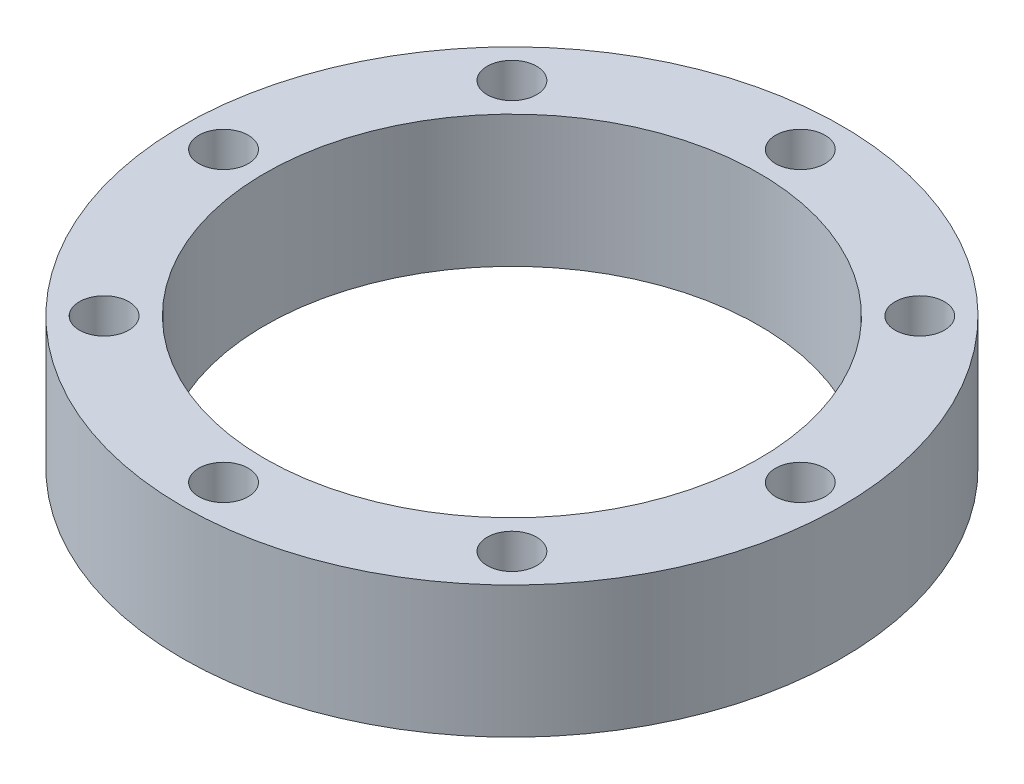
ISO-10303-21;
HEADER;
FILE_DESCRIPTION(('STEP AP214'),'2;1');
FILE_NAME('part.step','',(''),(''),'','','');
FILE_SCHEMA(('AUTOMOTIVE_DESIGN { 1 0 10303 214 1 1 1 1 }'));
ENDSEC;
DATA;
#1=APPLICATION_CONTEXT('core data for automotive mechanical design processes');
#2=APPLICATION_PROTOCOL_DEFINITION('international standard','automotive_design',2000,#1);
#3=PRODUCT_CONTEXT('',#1,'mechanical');
#4=PRODUCT('Part','Part','',(#3));
#5=PRODUCT_RELATED_PRODUCT_CATEGORY('part','',(#4));
#6=PRODUCT_DEFINITION_FORMATION('','',#4);
#7=PRODUCT_DEFINITION_CONTEXT('part definition',#1,'design');
#8=PRODUCT_DEFINITION('design','',#6,#7);
#9=PRODUCT_DEFINITION_SHAPE('','',#8);
#10=(LENGTH_UNIT() NAMED_UNIT(*) SI_UNIT(.MILLI.,.METRE.));
#11=(NAMED_UNIT(*) PLANE_ANGLE_UNIT() SI_UNIT($,.RADIAN.));
#12=(NAMED_UNIT(*) SI_UNIT($,.STERADIAN.) SOLID_ANGLE_UNIT());
#13=UNCERTAINTY_MEASURE_WITH_UNIT(LENGTH_MEASURE(1.E-05),#10,'distance_accuracy_value','');
#14=(GEOMETRIC_REPRESENTATION_CONTEXT(3) GLOBAL_UNCERTAINTY_ASSIGNED_CONTEXT((#13)) GLOBAL_UNIT_ASSIGNED_CONTEXT((#10,
#11,#12)) REPRESENTATION_CONTEXT('',''));
#15=CARTESIAN_POINT('',(0.,0.,0.));
#16=DIRECTION('',(0.,0.,1.));
#17=DIRECTION('',(1.,0.,0.));
#18=AXIS2_PLACEMENT_3D('',#15,#16,#17);
#19=CARTESIAN_POINT('',(0.,8.,0.));
#20=DIRECTION('',(0.,1.,0.));
#21=DIRECTION('',(0.,0.,1.));
#22=AXIS2_PLACEMENT_3D('',#19,#20,#21);
#23=PLANE('',#22);
#24=CARTESIAN_POINT('',(-17.5,8.,-1.83302770289265E-13));
#25=DIRECTION('',(0.,1.,0.));
#26=DIRECTION('',(0.,0.,1.));
#27=AXIS2_PLACEMENT_3D('',#24,#25,#26);
#28=CIRCLE('',#27,1.5);
#29=CARTESIAN_POINT('',(-17.5,8.,1.49999999999982));
#30=VERTEX_POINT('',#29);
#31=EDGE_CURVE('E110',#30,#30,#28,.T.);
#32=ORIENTED_EDGE('',*,*,#31,.F.);
#33=EDGE_LOOP('',(#32));
#34=FACE_BOUND('',#33,.T.);
#35=CARTESIAN_POINT('',(-1.2220184685951E-13,8.,17.5));
#36=DIRECTION('',(0.,1.,0.));
#37=DIRECTION('',(0.,0.,1.));
#38=AXIS2_PLACEMENT_3D('',#35,#36,#37);
#39=CIRCLE('',#38,1.5);
#40=CARTESIAN_POINT('',(-1.2220184685951E-13,8.,19.));
#41=VERTEX_POINT('',#40);
#42=EDGE_CURVE('E94',#41,#41,#39,.T.);
#43=ORIENTED_EDGE('',*,*,#42,.F.);
#44=EDGE_LOOP('',(#43));
#45=FACE_BOUND('',#44,.T.);
#46=CARTESIAN_POINT('',(17.5,8.,0.));
#47=DIRECTION('',(0.,1.,0.));
#48=DIRECTION('',(0.,0.,1.));
#49=AXIS2_PLACEMENT_3D('',#46,#47,#48);
#50=CIRCLE('',#49,1.5);
#51=CARTESIAN_POINT('',(17.5,8.,1.50000000000006));
#52=VERTEX_POINT('',#51);
#53=EDGE_CURVE('E78',#52,#52,#50,.T.);
#54=ORIENTED_EDGE('',*,*,#53,.F.);
#55=EDGE_LOOP('',(#54));
#56=FACE_BOUND('',#55,.T.);
#57=CARTESIAN_POINT('',(0.,8.,-17.5));
#58=DIRECTION('',(0.,1.,0.));
#59=DIRECTION('',(0.,0.,1.));
#60=AXIS2_PLACEMENT_3D('',#57,#58,#59);
#61=CIRCLE('',#60,1.5);
#62=CARTESIAN_POINT('',(0.,8.,-16.));
#63=VERTEX_POINT('',#62);
#64=EDGE_CURVE('E62',#63,#63,#61,.T.);
#65=ORIENTED_EDGE('',*,*,#64,.F.);
#66=EDGE_LOOP('',(#65));
#67=FACE_BOUND('',#66,.T.);
#68=CARTESIAN_POINT('',(0.,8.,0.));
#69=DIRECTION('',(0.,1.,0.));
#70=DIRECTION('',(0.,0.,1.));
#71=AXIS2_PLACEMENT_3D('',#68,#69,#70);
#72=CIRCLE('',#71,20.);
#73=CARTESIAN_POINT('',(0.,8.,20.));
#74=VERTEX_POINT('',#73);
#75=EDGE_CURVE('E10',#74,#74,#72,.T.);
#76=ORIENTED_EDGE('',*,*,#75,.T.);
#77=EDGE_LOOP('',(#76));
#78=FACE_BOUND('',#77,.T.);
#79=CARTESIAN_POINT('',(0.,8.,0.));
#80=DIRECTION('',(0.,1.,0.));
#81=DIRECTION('',(0.,0.,1.));
#82=AXIS2_PLACEMENT_3D('',#79,#80,#81);
#83=CIRCLE('',#82,15.);
#84=CARTESIAN_POINT('',(0.,8.,15.));
#85=VERTEX_POINT('',#84);
#86=EDGE_CURVE('E56',#85,#85,#83,.T.);
#87=ORIENTED_EDGE('',*,*,#86,.F.);
#88=EDGE_LOOP('',(#87));
#89=FACE_BOUND('',#88,.T.);
#90=CARTESIAN_POINT('',(12.3743686707646,8.,-12.3743686707646));
#91=DIRECTION('',(0.,1.,0.));
#92=DIRECTION('',(0.,0.,1.));
#93=AXIS2_PLACEMENT_3D('',#90,#91,#92);
#94=CIRCLE('',#93,1.5);
#95=CARTESIAN_POINT('',(12.3743686707646,8.,-10.8743686707646));
#96=VERTEX_POINT('',#95);
#97=EDGE_CURVE('E70',#96,#96,#94,.T.);
#98=ORIENTED_EDGE('',*,*,#97,.F.);
#99=EDGE_LOOP('',(#98));
#100=FACE_BOUND('',#99,.T.);
#101=CARTESIAN_POINT('',(12.3743686707645,8.,12.3743686707646));
#102=DIRECTION('',(0.,1.,0.));
#103=DIRECTION('',(0.,0.,1.));
#104=AXIS2_PLACEMENT_3D('',#101,#102,#103);
#105=CIRCLE('',#104,1.5);
#106=CARTESIAN_POINT('',(12.3743686707645,8.,13.8743686707646));
#107=VERTEX_POINT('',#106);
#108=EDGE_CURVE('E86',#107,#107,#105,.T.);
#109=ORIENTED_EDGE('',*,*,#108,.F.);
#110=EDGE_LOOP('',(#109));
#111=FACE_BOUND('',#110,.T.);
#112=CARTESIAN_POINT('',(-12.3743686707647,8.,12.3743686707645));
#113=DIRECTION('',(0.,1.,0.));
#114=DIRECTION('',(0.,0.,1.));
#115=AXIS2_PLACEMENT_3D('',#112,#113,#114);
#116=CIRCLE('',#115,1.5);
#117=CARTESIAN_POINT('',(-12.3743686707647,8.,13.8743686707645));
#118=VERTEX_POINT('',#117);
#119=EDGE_CURVE('E102',#118,#118,#116,.T.);
#120=ORIENTED_EDGE('',*,*,#119,.F.);
#121=EDGE_LOOP('',(#120));
#122=FACE_BOUND('',#121,.T.);
#123=CARTESIAN_POINT('',(-12.3743686707644,8.,-12.3743686707647));
#124=DIRECTION('',(0.,1.,0.));
#125=DIRECTION('',(0.,0.,1.));
#126=AXIS2_PLACEMENT_3D('',#123,#124,#125);
#127=CIRCLE('',#126,1.5);
#128=CARTESIAN_POINT('',(-12.3743686707644,8.,-10.8743686707647));
#129=VERTEX_POINT('',#128);
#130=EDGE_CURVE('E118',#129,#129,#127,.T.);
#131=ORIENTED_EDGE('',*,*,#130,.F.);
#132=EDGE_LOOP('',(#131));
#133=FACE_BOUND('',#132,.T.);
#134=ADVANCED_FACE('F43',(#34,#45,#56,#67,#78,#89,#100,#111,#122,#133),#23,.T.);
#135=CARTESIAN_POINT('',(0.,0.,0.));
#136=DIRECTION('',(0.,1.,0.));
#137=DIRECTION('',(0.,0.,1.));
#138=AXIS2_PLACEMENT_3D('',#135,#136,#137);
#139=PLANE('',#138);
#140=CARTESIAN_POINT('',(0.,0.,0.));
#141=DIRECTION('',(0.,1.,0.));
#142=DIRECTION('',(0.,0.,1.));
#143=AXIS2_PLACEMENT_3D('',#140,#141,#142);
#144=CIRCLE('',#143,20.);
#145=CARTESIAN_POINT('',(0.,0.,20.));
#146=VERTEX_POINT('',#145);
#147=EDGE_CURVE('E47',#146,#146,#144,.T.);
#148=ORIENTED_EDGE('',*,*,#147,.F.);
#149=EDGE_LOOP('',(#148));
#150=FACE_BOUND('',#149,.T.);
#151=CARTESIAN_POINT('',(0.,0.,0.));
#152=DIRECTION('',(0.,1.,0.));
#153=DIRECTION('',(0.,0.,1.));
#154=AXIS2_PLACEMENT_3D('',#151,#152,#153);
#155=CIRCLE('',#154,15.);
#156=CARTESIAN_POINT('',(0.,0.,15.));
#157=VERTEX_POINT('',#156);
#158=EDGE_CURVE('E58',#157,#157,#155,.T.);
#159=ORIENTED_EDGE('',*,*,#158,.T.);
#160=EDGE_LOOP('',(#159));
#161=FACE_BOUND('',#160,.T.);
#162=CARTESIAN_POINT('',(0.,0.,-17.5));
#163=DIRECTION('',(0.,1.,0.));
#164=DIRECTION('',(0.,0.,1.));
#165=AXIS2_PLACEMENT_3D('',#162,#163,#164);
#166=CIRCLE('',#165,1.5);
#167=CARTESIAN_POINT('',(0.,0.,-16.));
#168=VERTEX_POINT('',#167);
#169=EDGE_CURVE('E66',#168,#168,#166,.T.);
#170=ORIENTED_EDGE('',*,*,#169,.T.);
#171=EDGE_LOOP('',(#170));
#172=FACE_BOUND('',#171,.T.);
#173=CARTESIAN_POINT('',(12.3743686707646,0.,-12.3743686707646));
#174=DIRECTION('',(0.,1.,0.));
#175=DIRECTION('',(0.,0.,1.));
#176=AXIS2_PLACEMENT_3D('',#173,#174,#175);
#177=CIRCLE('',#176,1.5);
#178=CARTESIAN_POINT('',(12.3743686707646,0.,-10.8743686707646));
#179=VERTEX_POINT('',#178);
#180=EDGE_CURVE('E74',#179,#179,#177,.T.);
#181=ORIENTED_EDGE('',*,*,#180,.T.);
#182=EDGE_LOOP('',(#181));
#183=FACE_BOUND('',#182,.T.);
#184=CARTESIAN_POINT('',(17.5,0.,0.));
#185=DIRECTION('',(0.,1.,0.));
#186=DIRECTION('',(0.,0.,1.));
#187=AXIS2_PLACEMENT_3D('',#184,#185,#186);
#188=CIRCLE('',#187,1.5);
#189=CARTESIAN_POINT('',(17.5,0.,1.50000000000006));
#190=VERTEX_POINT('',#189);
#191=EDGE_CURVE('E82',#190,#190,#188,.T.);
#192=ORIENTED_EDGE('',*,*,#191,.T.);
#193=EDGE_LOOP('',(#192));
#194=FACE_BOUND('',#193,.T.);
#195=CARTESIAN_POINT('',(12.3743686707645,0.,12.3743686707646));
#196=DIRECTION('',(0.,1.,0.));
#197=DIRECTION('',(0.,0.,1.));
#198=AXIS2_PLACEMENT_3D('',#195,#196,#197);
#199=CIRCLE('',#198,1.5);
#200=CARTESIAN_POINT('',(12.3743686707645,0.,13.8743686707646));
#201=VERTEX_POINT('',#200);
#202=EDGE_CURVE('E90',#201,#201,#199,.T.);
#203=ORIENTED_EDGE('',*,*,#202,.T.);
#204=EDGE_LOOP('',(#203));
#205=FACE_BOUND('',#204,.T.);
#206=CARTESIAN_POINT('',(-1.2220184685951E-13,0.,17.5));
#207=DIRECTION('',(0.,1.,0.));
#208=DIRECTION('',(0.,0.,1.));
#209=AXIS2_PLACEMENT_3D('',#206,#207,#208);
#210=CIRCLE('',#209,1.5);
#211=CARTESIAN_POINT('',(-1.2220184685951E-13,0.,19.));
#212=VERTEX_POINT('',#211);
#213=EDGE_CURVE('E98',#212,#212,#210,.T.);
#214=ORIENTED_EDGE('',*,*,#213,.T.);
#215=EDGE_LOOP('',(#214));
#216=FACE_BOUND('',#215,.T.);
#217=CARTESIAN_POINT('',(-12.3743686707647,0.,12.3743686707645));
#218=DIRECTION('',(0.,1.,0.));
#219=DIRECTION('',(0.,0.,1.));
#220=AXIS2_PLACEMENT_3D('',#217,#218,#219);
#221=CIRCLE('',#220,1.5);
#222=CARTESIAN_POINT('',(-12.3743686707647,0.,13.8743686707645));
#223=VERTEX_POINT('',#222);
#224=EDGE_CURVE('E106',#223,#223,#221,.T.);
#225=ORIENTED_EDGE('',*,*,#224,.T.);
#226=EDGE_LOOP('',(#225));
#227=FACE_BOUND('',#226,.T.);
#228=CARTESIAN_POINT('',(-17.5,0.,-1.83302770289265E-13));
#229=DIRECTION('',(0.,1.,0.));
#230=DIRECTION('',(0.,0.,1.));
#231=AXIS2_PLACEMENT_3D('',#228,#229,#230);
#232=CIRCLE('',#231,1.5);
#233=CARTESIAN_POINT('',(-17.5,0.,1.49999999999982));
#234=VERTEX_POINT('',#233);
#235=EDGE_CURVE('E114',#234,#234,#232,.T.);
#236=ORIENTED_EDGE('',*,*,#235,.T.);
#237=EDGE_LOOP('',(#236));
#238=FACE_BOUND('',#237,.T.);
#239=CARTESIAN_POINT('',(-12.3743686707644,0.,-12.3743686707647));
#240=DIRECTION('',(0.,1.,0.));
#241=DIRECTION('',(0.,0.,1.));
#242=AXIS2_PLACEMENT_3D('',#239,#240,#241);
#243=CIRCLE('',#242,1.5);
#244=CARTESIAN_POINT('',(-12.3743686707644,0.,-10.8743686707647));
#245=VERTEX_POINT('',#244);
#246=EDGE_CURVE('E122',#245,#245,#243,.T.);
#247=ORIENTED_EDGE('',*,*,#246,.T.);
#248=EDGE_LOOP('',(#247));
#249=FACE_BOUND('',#248,.T.);
#250=ADVANCED_FACE('F134',(#150,#161,#172,#183,#194,#205,#216,#227,#238,#249),#139,.F.);
#251=CARTESIAN_POINT('',(0.,8.,0.));
#252=DIRECTION('',(0.,-1.,0.));
#253=DIRECTION('',(0.,0.,-1.));
#254=AXIS2_PLACEMENT_3D('',#251,#252,#253);
#255=CYLINDRICAL_SURFACE('',#254,20.);
#256=ORIENTED_EDGE('',*,*,#75,.F.);
#257=EDGE_LOOP('',(#256));
#258=FACE_BOUND('',#257,.T.);
#259=ORIENTED_EDGE('',*,*,#147,.T.);
#260=EDGE_LOOP('',(#259));
#261=FACE_BOUND('',#260,.T.);
#262=ADVANCED_FACE('F45',(#258,#261),#255,.T.);
#263=CARTESIAN_POINT('',(0.,8.,0.));
#264=DIRECTION('',(0.,-1.,0.));
#265=DIRECTION('',(0.,0.,-1.));
#266=AXIS2_PLACEMENT_3D('',#263,#264,#265);
#267=CYLINDRICAL_SURFACE('',#266,15.);
#268=ORIENTED_EDGE('',*,*,#86,.T.);
#269=EDGE_LOOP('',(#268));
#270=FACE_BOUND('',#269,.T.);
#271=ORIENTED_EDGE('',*,*,#158,.F.);
#272=EDGE_LOOP('',(#271));
#273=FACE_BOUND('',#272,.T.);
#274=ADVANCED_FACE('F144',(#270,#273),#267,.F.);
#275=CARTESIAN_POINT('',(0.,8.,-17.5));
#276=DIRECTION('',(0.,-1.,0.));
#277=DIRECTION('',(0.,0.,-1.));
#278=AXIS2_PLACEMENT_3D('',#275,#276,#277);
#279=CYLINDRICAL_SURFACE('',#278,1.5);
#280=ORIENTED_EDGE('',*,*,#64,.T.);
#281=EDGE_LOOP('',(#280));
#282=FACE_BOUND('',#281,.T.);
#283=ORIENTED_EDGE('',*,*,#169,.F.);
#284=EDGE_LOOP('',(#283));
#285=FACE_BOUND('',#284,.T.);
#286=ADVANCED_FACE('F147',(#282,#285),#279,.F.);
#287=CARTESIAN_POINT('',(12.3743686707646,8.,-12.3743686707646));
#288=DIRECTION('',(0.,-1.,0.));
#289=DIRECTION('',(0.,0.,-1.));
#290=AXIS2_PLACEMENT_3D('',#287,#288,#289);
#291=CYLINDRICAL_SURFACE('',#290,1.5);
#292=ORIENTED_EDGE('',*,*,#97,.T.);
#293=EDGE_LOOP('',(#292));
#294=FACE_BOUND('',#293,.T.);
#295=ORIENTED_EDGE('',*,*,#180,.F.);
#296=EDGE_LOOP('',(#295));
#297=FACE_BOUND('',#296,.T.);
#298=ADVANCED_FACE('F151',(#294,#297),#291,.F.);
#299=CARTESIAN_POINT('',(17.5,8.,0.));
#300=DIRECTION('',(0.,-1.,0.));
#301=DIRECTION('',(0.,0.,-1.));
#302=AXIS2_PLACEMENT_3D('',#299,#300,#301);
#303=CYLINDRICAL_SURFACE('',#302,1.5);
#304=ORIENTED_EDGE('',*,*,#53,.T.);
#305=EDGE_LOOP('',(#304));
#306=FACE_BOUND('',#305,.T.);
#307=ORIENTED_EDGE('',*,*,#191,.F.);
#308=EDGE_LOOP('',(#307));
#309=FACE_BOUND('',#308,.T.);
#310=ADVANCED_FACE('F155',(#306,#309),#303,.F.);
#311=CARTESIAN_POINT('',(12.3743686707645,8.,12.3743686707646));
#312=DIRECTION('',(0.,-1.,0.));
#313=DIRECTION('',(0.,0.,-1.));
#314=AXIS2_PLACEMENT_3D('',#311,#312,#313);
#315=CYLINDRICAL_SURFACE('',#314,1.5);
#316=ORIENTED_EDGE('',*,*,#108,.T.);
#317=EDGE_LOOP('',(#316));
#318=FACE_BOUND('',#317,.T.);
#319=ORIENTED_EDGE('',*,*,#202,.F.);
#320=EDGE_LOOP('',(#319));
#321=FACE_BOUND('',#320,.T.);
#322=ADVANCED_FACE('F159',(#318,#321),#315,.F.);
#323=CARTESIAN_POINT('',(-1.2220184685951E-13,8.,17.5));
#324=DIRECTION('',(0.,-1.,0.));
#325=DIRECTION('',(0.,0.,-1.));
#326=AXIS2_PLACEMENT_3D('',#323,#324,#325);
#327=CYLINDRICAL_SURFACE('',#326,1.5);
#328=ORIENTED_EDGE('',*,*,#42,.T.);
#329=EDGE_LOOP('',(#328));
#330=FACE_BOUND('',#329,.T.);
#331=ORIENTED_EDGE('',*,*,#213,.F.);
#332=EDGE_LOOP('',(#331));
#333=FACE_BOUND('',#332,.T.);
#334=ADVANCED_FACE('F163',(#330,#333),#327,.F.);
#335=CARTESIAN_POINT('',(-12.3743686707647,8.,12.3743686707645));
#336=DIRECTION('',(0.,-1.,0.));
#337=DIRECTION('',(0.,0.,-1.));
#338=AXIS2_PLACEMENT_3D('',#335,#336,#337);
#339=CYLINDRICAL_SURFACE('',#338,1.5);
#340=ORIENTED_EDGE('',*,*,#119,.T.);
#341=EDGE_LOOP('',(#340));
#342=FACE_BOUND('',#341,.T.);
#343=ORIENTED_EDGE('',*,*,#224,.F.);
#344=EDGE_LOOP('',(#343));
#345=FACE_BOUND('',#344,.T.);
#346=ADVANCED_FACE('F167',(#342,#345),#339,.F.);
#347=CARTESIAN_POINT('',(-17.5,8.,-1.83302770289265E-13));
#348=DIRECTION('',(0.,-1.,0.));
#349=DIRECTION('',(0.,0.,-1.));
#350=AXIS2_PLACEMENT_3D('',#347,#348,#349);
#351=CYLINDRICAL_SURFACE('',#350,1.5);
#352=ORIENTED_EDGE('',*,*,#31,.T.);
#353=EDGE_LOOP('',(#352));
#354=FACE_BOUND('',#353,.T.);
#355=ORIENTED_EDGE('',*,*,#235,.F.);
#356=EDGE_LOOP('',(#355));
#357=FACE_BOUND('',#356,.T.);
#358=ADVANCED_FACE('F171',(#354,#357),#351,.F.);
#359=CARTESIAN_POINT('',(-12.3743686707644,8.,-12.3743686707647));
#360=DIRECTION('',(0.,-1.,0.));
#361=DIRECTION('',(0.,0.,-1.));
#362=AXIS2_PLACEMENT_3D('',#359,#360,#361);
#363=CYLINDRICAL_SURFACE('',#362,1.5);
#364=ORIENTED_EDGE('',*,*,#130,.T.);
#365=EDGE_LOOP('',(#364));
#366=FACE_BOUND('',#365,.T.);
#367=ORIENTED_EDGE('',*,*,#246,.F.);
#368=EDGE_LOOP('',(#367));
#369=FACE_BOUND('',#368,.T.);
#370=ADVANCED_FACE('F130',(#366,#369),#363,.F.);
#371=CLOSED_SHELL('',(#134,#250,#262,#274,#286,#298,#310,#322,#334,#346,#358,#370));
#372=MANIFOLD_SOLID_BREP('B2',#371);
#373=ADVANCED_BREP_SHAPE_REPRESENTATION('',(#18,#372),#14);
#374=SHAPE_DEFINITION_REPRESENTATION(#9,#373);
ENDSEC;
END-ISO-10303-21;
